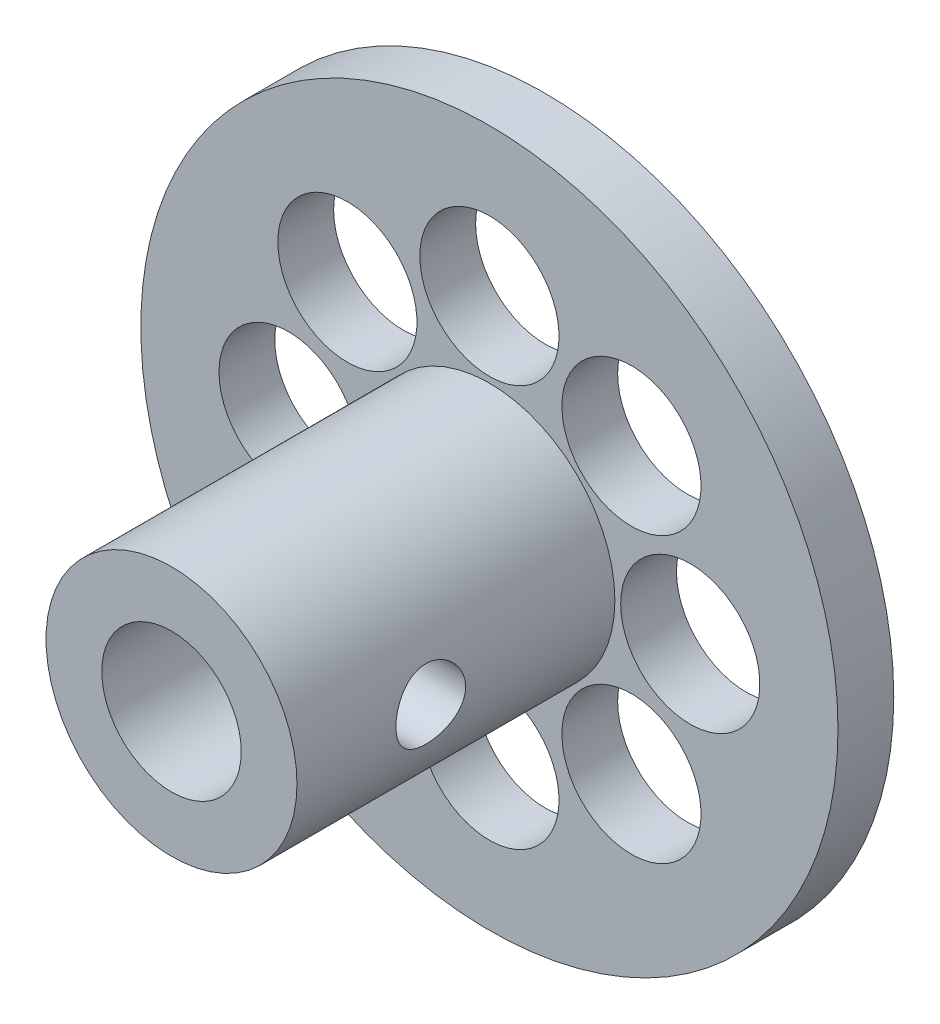
ISO-10303-21;
HEADER;
FILE_DESCRIPTION(('STEP AP214'),'2;1');
FILE_NAME('part.step','',(''),(''),'','','');
FILE_SCHEMA(('AUTOMOTIVE_DESIGN { 1 0 10303 214 1 1 1 1 }'));
ENDSEC;
DATA;
#1=APPLICATION_CONTEXT('core data for automotive mechanical design processes');
#2=APPLICATION_PROTOCOL_DEFINITION('international standard','automotive_design',2000,#1);
#3=PRODUCT_CONTEXT('',#1,'mechanical');
#4=PRODUCT('Part','Part','',(#3));
#5=PRODUCT_RELATED_PRODUCT_CATEGORY('part','',(#4));
#6=PRODUCT_DEFINITION_FORMATION('','',#4);
#7=PRODUCT_DEFINITION_CONTEXT('part definition',#1,'design');
#8=PRODUCT_DEFINITION('design','',#6,#7);
#9=PRODUCT_DEFINITION_SHAPE('','',#8);
#10=(LENGTH_UNIT() NAMED_UNIT(*) SI_UNIT(.MILLI.,.METRE.));
#11=(NAMED_UNIT(*) PLANE_ANGLE_UNIT() SI_UNIT($,.RADIAN.));
#12=(NAMED_UNIT(*) SI_UNIT($,.STERADIAN.) SOLID_ANGLE_UNIT());
#13=UNCERTAINTY_MEASURE_WITH_UNIT(LENGTH_MEASURE(1.E-05),#10,'distance_accuracy_value','');
#14=(GEOMETRIC_REPRESENTATION_CONTEXT(3) GLOBAL_UNCERTAINTY_ASSIGNED_CONTEXT((#13)) GLOBAL_UNIT_ASSIGNED_CONTEXT((#10,
#11,#12)) REPRESENTATION_CONTEXT('',''));
#15=CARTESIAN_POINT('',(0.,0.,0.));
#16=DIRECTION('',(0.,0.,1.));
#17=DIRECTION('',(1.,0.,0.));
#18=AXIS2_PLACEMENT_3D('',#15,#16,#17);
#19=CARTESIAN_POINT('',(0.,0.,5.08));
#20=DIRECTION('',(0.,0.,-1.));
#21=DIRECTION('',(-1.,0.,0.));
#22=AXIS2_PLACEMENT_3D('',#19,#20,#21);
#23=CYLINDRICAL_SURFACE('',#22,6.35);
#24=CARTESIAN_POINT('',(0.,0.,34.036));
#25=DIRECTION('',(0.,0.,1.));
#26=DIRECTION('',(1.,0.,0.));
#27=AXIS2_PLACEMENT_3D('',#24,#25,#26);
#28=CIRCLE('',#27,6.35);
#29=CARTESIAN_POINT('',(6.35,0.,34.036));
#30=VERTEX_POINT('',#29);
#31=EDGE_CURVE('E171',#30,#30,#28,.T.);
#32=ORIENTED_EDGE('',*,*,#31,.T.);
#33=EDGE_LOOP('',(#32));
#34=FACE_BOUND('',#33,.T.);
#35=CARTESIAN_POINT('',(0.,0.,0.));
#36=DIRECTION('',(0.,0.,-1.));
#37=DIRECTION('',(-1.,0.,0.));
#38=AXIS2_PLACEMENT_3D('',#35,#36,#37);
#39=CIRCLE('',#38,6.35);
#40=CARTESIAN_POINT('',(-6.35,0.,0.));
#41=VERTEX_POINT('',#40);
#42=EDGE_CURVE('E48',#41,#41,#39,.T.);
#43=ORIENTED_EDGE('',*,*,#42,.T.);
#44=EDGE_LOOP('',(#43));
#45=FACE_BOUND('',#44,.T.);
#46=CARTESIAN_POINT('',(6.35,0.,25.0263136778995));
#47=CARTESIAN_POINT('',(6.34999931166444,0.0834969220594999,25.0263127901819));
#48=CARTESIAN_POINT('',(6.34834758911701,0.167002655580042,25.0230138034535));
#49=CARTESIAN_POINT('',(6.34179105821714,0.333378330258781,25.0098678033496));
#50=CARTESIAN_POINT('',(6.33688483467113,0.416247978955771,25.0000179413737));
#51=CARTESIAN_POINT('',(6.31742426748325,0.66318203064701,24.9607416128535));
#52=CARTESIAN_POINT('',(6.29812827299425,0.825450146761554,24.9215886004981));
#53=CARTESIAN_POINT('',(6.2489182313574,1.13965128900426,24.8193229666053));
#54=CARTESIAN_POINT('',(6.21904547786825,1.29162180811868,24.7563034586561));
#55=CARTESIAN_POINT('',(6.15142812041637,1.58264035037879,24.6085776042706));
#56=CARTESIAN_POINT('',(6.11368413715877,1.72168939123018,24.5238729677485));
#57=CARTESIAN_POINT('',(6.03111096182982,1.99234108848171,24.3293440481653));
#58=CARTESIAN_POINT('',(5.98599127270818,2.12298433900091,24.2183101001056));
#59=CARTESIAN_POINT('',(5.89470535591056,2.36467069069853,23.9769169943267));
#60=CARTESIAN_POINT('',(5.84853836069043,2.47569885601321,23.8465432481331));
#61=CARTESIAN_POINT('',(5.75623634934464,2.68368848497886,23.5578927301462));
#62=CARTESIAN_POINT('',(5.71038146176788,2.77889135161934,23.3982361465979));
#63=CARTESIAN_POINT('',(5.64919759286363,2.90019349951534,23.1467656907251));
#64=CARTESIAN_POINT('',(5.63006420805933,2.93705266116892,23.0609136160708));
#65=CARTESIAN_POINT('',(5.59504604853267,3.00322508739606,22.8857280641931));
#66=CARTESIAN_POINT('',(5.57915935583429,3.03254280972159,22.7963966797189));
#67=CARTESIAN_POINT('',(5.55212611635049,3.08174263292982,22.6203031259348));
#68=CARTESIAN_POINT('',(5.54075429137746,3.10208128111978,22.5337028838709));
#69=CARTESIAN_POINT('',(5.52193654886444,3.13545600360765,22.3587263989051));
#70=CARTESIAN_POINT('',(5.51448854851135,3.14849595237258,22.2703511241278));
#71=CARTESIAN_POINT('',(5.50383875782918,3.1670771305344,22.0926069390509));
#72=CARTESIAN_POINT('',(5.50063441026522,3.1726228759965,22.0032386599121));
#73=CARTESIAN_POINT('',(5.49859788398609,3.17614778806993,21.8243328937214));
#74=CARTESIAN_POINT('',(5.49976528812799,3.17412767659872,21.7347954236282));
#75=CARTESIAN_POINT('',(5.50899190362732,3.1581193033026,21.4885658021751));
#76=CARTESIAN_POINT('',(5.52160857357707,3.13621253452965,21.3324719480861));
#77=CARTESIAN_POINT('',(5.55866493052824,3.07003746372168,21.026667036593));
#78=CARTESIAN_POINT('',(5.58310838358077,3.02576203854505,20.8769580288767));
#79=CARTESIAN_POINT('',(5.64157885407236,2.91531509833647,20.5837693813354));
#80=CARTESIAN_POINT('',(5.67581583876129,2.84865758129418,20.4405160679629));
#81=CARTESIAN_POINT('',(5.75003268807633,2.69570761526054,20.1665475917255));
#82=CARTESIAN_POINT('',(5.79001512927804,2.60940634674629,20.035838098291));
#83=CARTESIAN_POINT('',(5.87734289018611,2.40685964249565,19.7732094036492));
#84=CARTESIAN_POINT('',(5.92497898403936,2.28820488335253,19.643238293043));
#85=CARTESIAN_POINT('',(6.01813700574905,2.03058898448427,19.4042285350357));
#86=CARTESIAN_POINT('',(6.06365791538158,1.89161819563546,19.2951998915408));
#87=CARTESIAN_POINT('',(6.1500381059768,1.58913989972483,19.0964117581798));
#88=CARTESIAN_POINT('',(6.19058274974572,1.42479265164789,19.0077821923196));
#89=CARTESIAN_POINT('',(6.25976272299952,1.08098023585583,18.8601555962641));
#90=CARTESIAN_POINT('',(6.28840750578946,0.901527205073898,18.8011350367678));
#91=CARTESIAN_POINT('',(6.32854759690358,0.548533610626836,18.7192542745004));
#92=CARTESIAN_POINT('',(6.34126679122995,0.375734359385247,18.6938040053122));
#93=CARTESIAN_POINT('',(6.35231817716325,0.0278752299448339,18.6716631556392));
#94=CARTESIAN_POINT('',(6.35065718436129,-0.147183538060017,18.6749589507602));
#95=CARTESIAN_POINT('',(6.33384535408399,-0.48016468608036,18.7087199138449));
#96=CARTESIAN_POINT('',(6.31975005060431,-0.638363620564188,18.7370594693743));
#97=CARTESIAN_POINT('',(6.28085393924121,-0.947441883052999,18.8167695561094));
#98=CARTESIAN_POINT('',(6.25605195113515,-1.09832040207141,18.8681426263768));
#99=CARTESIAN_POINT('',(6.19709998236334,-1.39347133182512,18.9938088088373));
#100=CARTESIAN_POINT('',(6.16270299610718,-1.53743151047822,19.0687152620107));
#101=CARTESIAN_POINT('',(6.08787118465664,-1.8112148234104,19.2386301035854));
#102=CARTESIAN_POINT('',(6.0474337895468,-1.94103189959927,19.3336470552849));
#103=CARTESIAN_POINT('',(5.95973602709938,-2.19636241342679,19.5518530282733));
#104=CARTESIAN_POINT('',(5.91219559251098,-2.3202013468198,19.6768922850111));
#105=CARTESIAN_POINT('',(5.81858093231368,-2.54589381918874,19.9460760330492));
#106=CARTESIAN_POINT('',(5.77250773963547,-2.6477321493525,20.0902336302804));
#107=CARTESIAN_POINT('',(5.68487535288742,-2.83117262876716,20.4023822798579));
#108=CARTESIAN_POINT('',(5.64364281441821,-2.91155594998014,20.5711894474099));
#109=CARTESIAN_POINT('',(5.5744767953732,-3.04191297152939,20.9226581427892));
#110=CARTESIAN_POINT('',(5.54652618900868,-3.0919258549222,21.1053014757469));
#111=CARTESIAN_POINT('',(5.51057765714603,-3.15551086037918,21.4605036343697));
#112=CARTESIAN_POINT('',(5.50092192343244,-3.17212027309711,21.6323474283067));
#113=CARTESIAN_POINT('',(5.49800001145358,-3.17718805563876,21.9765581203947));
#114=CARTESIAN_POINT('',(5.5047267290444,-3.16565862768386,22.1489247594421));
#115=CARTESIAN_POINT('',(5.53205211477784,-3.11761548073658,22.4719737809734));
#116=CARTESIAN_POINT('',(5.55126823076269,-3.08358651207687,22.6231576196306));
#117=CARTESIAN_POINT('',(5.59977978302582,-2.99458164828807,22.9175045080667));
#118=CARTESIAN_POINT('',(5.62907846127335,-2.93959901505999,23.0606649607498));
#119=CARTESIAN_POINT('',(5.69685576337174,-2.8061154442137,23.345547377328));
#120=CARTESIAN_POINT('',(5.73581889480532,-2.72628260503929,23.4865264872652));
#121=CARTESIAN_POINT('',(5.81772207082382,-2.54682759156583,23.7540111096226));
#122=CARTESIAN_POINT('',(5.8606641782013,-2.44719512169931,23.8805090378422));
#123=CARTESIAN_POINT('',(5.95192753761203,-2.21680287661219,24.1314112020766));
#124=CARTESIAN_POINT('',(6.00026839877346,-2.08373188558713,24.2536934343123));
#125=CARTESIAN_POINT('',(6.0921234557675,-1.79751265125244,24.4747115511326));
#126=CARTESIAN_POINT('',(6.13563504323043,-1.64435365457428,24.5734347438822));
#127=CARTESIAN_POINT('',(6.19391073190243,-1.40178715704487,24.7015939440966));
#128=CARTESIAN_POINT('',(6.21223173271383,-1.31842200030919,24.7411142615809));
#129=CARTESIAN_POINT('',(6.24595363475603,-1.14807701021671,24.8129131527232));
#130=CARTESIAN_POINT('',(6.26135597012704,-1.06109897786306,24.8451952844339));
#131=CARTESIAN_POINT('',(6.28875097111981,-0.88436132281311,24.9020730238145));
#132=CARTESIAN_POINT('',(6.30075106809478,-0.794608244970574,24.9266853960376));
#133=CARTESIAN_POINT('',(6.32100983571903,-0.612925661591584,24.9679810674294));
#134=CARTESIAN_POINT('',(6.3292707916836,-0.520997521680293,24.984669210093));
#135=CARTESIAN_POINT('',(6.34032503263334,-0.357531347524377,25.0069299627619));
#136=CARTESIAN_POINT('',(6.34394670812889,-0.286274046488598,25.0141924991491));
#137=CARTESIAN_POINT('',(6.34878452045567,-0.143346668941348,25.0238848044371));
#138=CARTESIAN_POINT('',(6.35000059089052,-0.0716765810914262,25.0263144399463));
#139=CARTESIAN_POINT('',(6.35,0.,25.0263136778995));
#140=B_SPLINE_CURVE_WITH_KNOTS('',3,(#46,#47,#48,#49,#50,#51,#52,#53,#54,#55,#56,#57,#58,#59,
#60,#61,#62,#63,#64,#65,#66,#67,#68,#69,#70,#71,#72,#73,#74,#75,#76,#77,#78,#79,#80,#81,#82,#83,
#84,#85,#86,#87,#88,#89,#90,#91,#92,#93,#94,#95,#96,#97,#98,#99,#100,#101,#102,#103,#104,#105,
#106,#107,#108,#109,#110,#111,#112,#113,#114,#115,#116,#117,#118,#119,#120,#121,#122,#123,#124,
#125,#126,#127,#128,#129,#130,#131,#132,#133,#134,#135,#136,#137,#138,#139),.UNSPECIFIED.,.T.,
.F.,(4,2,2,2,2,2,2,2,2,2,2,2,2,2,2,2,2,2,2,2,2,2,2,2,2,2,2,2,2,2,2,2,2,2,2,2,2,2,2,2,2,2,2,2,2,
2,4),(0.,0.25041561210268,0.500940186864013,1.00234854488129,1.50182051324263,2.00125310940106,
2.53090025348451,3.06094897410615,3.63210298373098,3.91787290005988,4.20347350732849,
4.47213270490103,4.74064915090148,5.00900371453887,5.27733267302577,5.74927594687739,
6.22136960256846,6.70445970327764,7.18776712794021,7.73235646527881,8.27720530143646,
8.84735553323666,9.41705196489304,9.93956405039339,10.4618285011675,10.9436138594975,
11.4254523397102,11.921067756814,12.4168946391879,12.9614122158798,13.5063050164601,
14.077585736555,14.6481278321882,15.1639000911419,15.6794487286237,16.1458838633213,
16.6124691169503,17.1104020806943,17.6085946442304,18.1673210354482,18.7263477502426,
19.0082017078365,19.2899168101042,19.5710117490933,19.8519346536844,20.0668939492148,
20.2818591776892),.UNSPECIFIED.);
#141=CARTESIAN_POINT('',(6.35,0.,25.0263136778995));
#142=VERTEX_POINT('',#141);
#143=EDGE_CURVE('E73',#142,#142,#140,.T.);
#144=ORIENTED_EDGE('',*,*,#143,.F.);
#145=EDGE_LOOP('',(#144));
#146=FACE_BOUND('',#145,.T.);
#147=CARTESIAN_POINT('',(-6.35,0.,25.0263136778995));
#148=CARTESIAN_POINT('',(-6.34999931166444,-0.0834969220594999,25.0263127901819));
#149=CARTESIAN_POINT('',(-6.34834758911701,-0.167002655580042,25.0230138034535));
#150=CARTESIAN_POINT('',(-6.34179105821714,-0.333378330258781,25.0098678033496));
#151=CARTESIAN_POINT('',(-6.33688483467113,-0.416247978955771,25.0000179413737));
#152=CARTESIAN_POINT('',(-6.31742426748325,-0.66318203064701,24.9607416128535));
#153=CARTESIAN_POINT('',(-6.29812827299425,-0.825450146761554,24.9215886004981));
#154=CARTESIAN_POINT('',(-6.2489182313574,-1.13965128900426,24.8193229666053));
#155=CARTESIAN_POINT('',(-6.21904547786825,-1.29162180811868,24.7563034586561));
#156=CARTESIAN_POINT('',(-6.15142812041637,-1.58264035037879,24.6085776042706));
#157=CARTESIAN_POINT('',(-6.11368413715877,-1.72168939123018,24.5238729677485));
#158=CARTESIAN_POINT('',(-6.03111096182982,-1.99234108848171,24.3293440481653));
#159=CARTESIAN_POINT('',(-5.98599127270818,-2.12298433900091,24.2183101001056));
#160=CARTESIAN_POINT('',(-5.89470535591056,-2.36467069069853,23.9769169943267));
#161=CARTESIAN_POINT('',(-5.84853836069043,-2.47569885601321,23.8465432481331));
#162=CARTESIAN_POINT('',(-5.75623634934464,-2.68368848497886,23.5578927301462));
#163=CARTESIAN_POINT('',(-5.71038146176788,-2.77889135161934,23.3982361465979));
#164=CARTESIAN_POINT('',(-5.64919759286363,-2.90019349951534,23.1467656907251));
#165=CARTESIAN_POINT('',(-5.63006420805933,-2.93705266116892,23.0609136160708));
#166=CARTESIAN_POINT('',(-5.59504604853267,-3.00322508739606,22.8857280641931));
#167=CARTESIAN_POINT('',(-5.57915935583429,-3.03254280972159,22.7963966797189));
#168=CARTESIAN_POINT('',(-5.55212611635049,-3.08174263292982,22.6203031259348));
#169=CARTESIAN_POINT('',(-5.54075429137746,-3.10208128111978,22.5337028838709));
#170=CARTESIAN_POINT('',(-5.52193654886444,-3.13545600360765,22.3587263989051));
#171=CARTESIAN_POINT('',(-5.51448854851135,-3.14849595237258,22.2703511241278));
#172=CARTESIAN_POINT('',(-5.50383875782918,-3.1670771305344,22.0926069390509));
#173=CARTESIAN_POINT('',(-5.50063441026522,-3.1726228759965,22.0032386599121));
#174=CARTESIAN_POINT('',(-5.49859788398609,-3.17614778806993,21.8243328937214));
#175=CARTESIAN_POINT('',(-5.49976528812799,-3.17412767659872,21.7347954236282));
#176=CARTESIAN_POINT('',(-5.50899190362732,-3.1581193033026,21.4885658021751));
#177=CARTESIAN_POINT('',(-5.52160857357707,-3.13621253452965,21.3324719480861));
#178=CARTESIAN_POINT('',(-5.55866493052824,-3.07003746372168,21.026667036593));
#179=CARTESIAN_POINT('',(-5.58310838358077,-3.02576203854505,20.8769580288767));
#180=CARTESIAN_POINT('',(-5.64157885407236,-2.91531509833647,20.5837693813354));
#181=CARTESIAN_POINT('',(-5.67581583876129,-2.84865758129418,20.4405160679629));
#182=CARTESIAN_POINT('',(-5.75003268807633,-2.69570761526054,20.1665475917255));
#183=CARTESIAN_POINT('',(-5.79001512927804,-2.60940634674629,20.035838098291));
#184=CARTESIAN_POINT('',(-5.87734289018611,-2.40685964249565,19.7732094036492));
#185=CARTESIAN_POINT('',(-5.92497898403936,-2.28820488335253,19.643238293043));
#186=CARTESIAN_POINT('',(-6.01813700574905,-2.03058898448427,19.4042285350357));
#187=CARTESIAN_POINT('',(-6.06365791538158,-1.89161819563546,19.2951998915408));
#188=CARTESIAN_POINT('',(-6.1500381059768,-1.58913989972483,19.0964117581798));
#189=CARTESIAN_POINT('',(-6.19058274974572,-1.42479265164789,19.0077821923196));
#190=CARTESIAN_POINT('',(-6.25976272299952,-1.08098023585583,18.8601555962641));
#191=CARTESIAN_POINT('',(-6.28840750578946,-0.901527205073898,18.8011350367678));
#192=CARTESIAN_POINT('',(-6.32854759690358,-0.548533610626836,18.7192542745004));
#193=CARTESIAN_POINT('',(-6.34126679122995,-0.375734359385247,18.6938040053122));
#194=CARTESIAN_POINT('',(-6.35231817716325,-0.0278752299448339,18.6716631556392));
#195=CARTESIAN_POINT('',(-6.35065718436129,0.147183538060017,18.6749589507602));
#196=CARTESIAN_POINT('',(-6.33384535408399,0.48016468608036,18.7087199138449));
#197=CARTESIAN_POINT('',(-6.31975005060431,0.638363620564188,18.7370594693743));
#198=CARTESIAN_POINT('',(-6.28085393924121,0.947441883052999,18.8167695561094));
#199=CARTESIAN_POINT('',(-6.25605195113515,1.09832040207141,18.8681426263768));
#200=CARTESIAN_POINT('',(-6.19709998236334,1.39347133182512,18.9938088088373));
#201=CARTESIAN_POINT('',(-6.16270299610718,1.53743151047822,19.0687152620107));
#202=CARTESIAN_POINT('',(-6.08787118465664,1.8112148234104,19.2386301035854));
#203=CARTESIAN_POINT('',(-6.0474337895468,1.94103189959927,19.3336470552849));
#204=CARTESIAN_POINT('',(-5.95973602709938,2.19636241342679,19.5518530282733));
#205=CARTESIAN_POINT('',(-5.91219559251098,2.3202013468198,19.6768922850111));
#206=CARTESIAN_POINT('',(-5.81858093231368,2.54589381918874,19.9460760330492));
#207=CARTESIAN_POINT('',(-5.77250773963547,2.6477321493525,20.0902336302804));
#208=CARTESIAN_POINT('',(-5.68487535288742,2.83117262876716,20.4023822798579));
#209=CARTESIAN_POINT('',(-5.64364281441821,2.91155594998014,20.5711894474099));
#210=CARTESIAN_POINT('',(-5.5744767953732,3.04191297152939,20.9226581427892));
#211=CARTESIAN_POINT('',(-5.54652618900868,3.0919258549222,21.1053014757469));
#212=CARTESIAN_POINT('',(-5.51057765714603,3.15551086037918,21.4605036343697));
#213=CARTESIAN_POINT('',(-5.50092192343244,3.17212027309711,21.6323474283067));
#214=CARTESIAN_POINT('',(-5.49800001145358,3.17718805563876,21.9765581203947));
#215=CARTESIAN_POINT('',(-5.5047267290444,3.16565862768386,22.1489247594421));
#216=CARTESIAN_POINT('',(-5.53205211477784,3.11761548073658,22.4719737809734));
#217=CARTESIAN_POINT('',(-5.55126823076269,3.08358651207687,22.6231576196306));
#218=CARTESIAN_POINT('',(-5.59977978302582,2.99458164828807,22.9175045080667));
#219=CARTESIAN_POINT('',(-5.62907846127335,2.93959901505999,23.0606649607498));
#220=CARTESIAN_POINT('',(-5.69685576337174,2.8061154442137,23.345547377328));
#221=CARTESIAN_POINT('',(-5.73581889480532,2.72628260503929,23.4865264872652));
#222=CARTESIAN_POINT('',(-5.81772207082382,2.54682759156583,23.7540111096226));
#223=CARTESIAN_POINT('',(-5.8606641782013,2.44719512169931,23.8805090378422));
#224=CARTESIAN_POINT('',(-5.95192753761203,2.21680287661219,24.1314112020766));
#225=CARTESIAN_POINT('',(-6.00026839877346,2.08373188558713,24.2536934343123));
#226=CARTESIAN_POINT('',(-6.0921234557675,1.79751265125244,24.4747115511326));
#227=CARTESIAN_POINT('',(-6.13563504323043,1.64435365457428,24.5734347438822));
#228=CARTESIAN_POINT('',(-6.19391073190243,1.40178715704487,24.7015939440966));
#229=CARTESIAN_POINT('',(-6.21223173271383,1.31842200030919,24.7411142615809));
#230=CARTESIAN_POINT('',(-6.24595363475603,1.14807701021671,24.8129131527232));
#231=CARTESIAN_POINT('',(-6.26135597012704,1.06109897786306,24.8451952844339));
#232=CARTESIAN_POINT('',(-6.28875097111981,0.88436132281311,24.9020730238145));
#233=CARTESIAN_POINT('',(-6.30075106809478,0.794608244970574,24.9266853960376));
#234=CARTESIAN_POINT('',(-6.32100983571903,0.612925661591584,24.9679810674294));
#235=CARTESIAN_POINT('',(-6.3292707916836,0.520997521680293,24.984669210093));
#236=CARTESIAN_POINT('',(-6.34032503263334,0.357531347524377,25.0069299627619));
#237=CARTESIAN_POINT('',(-6.34394670812889,0.286274046488598,25.0141924991491));
#238=CARTESIAN_POINT('',(-6.34878452045567,0.143346668941348,25.0238848044371));
#239=CARTESIAN_POINT('',(-6.35000059089052,0.0716765810914262,25.0263144399463));
#240=CARTESIAN_POINT('',(-6.35,0.,25.0263136778995));
#241=B_SPLINE_CURVE_WITH_KNOTS('',3,(#147,#148,#149,#150,#151,#152,#153,#154,#155,#156,#157,
#158,#159,#160,#161,#162,#163,#164,#165,#166,#167,#168,#169,#170,#171,#172,#173,#174,#175,#176,
#177,#178,#179,#180,#181,#182,#183,#184,#185,#186,#187,#188,#189,#190,#191,#192,#193,#194,#195,
#196,#197,#198,#199,#200,#201,#202,#203,#204,#205,#206,#207,#208,#209,#210,#211,#212,#213,#214,
#215,#216,#217,#218,#219,#220,#221,#222,#223,#224,#225,#226,#227,#228,#229,#230,#231,#232,#233,
#234,#235,#236,#237,#238,#239,#240),.UNSPECIFIED.,.T.,.F.,(4,2,2,2,2,2,2,2,2,2,2,2,2,2,2,2,2,2,
2,2,2,2,2,2,2,2,2,2,2,2,2,2,2,2,2,2,2,2,2,2,2,2,2,2,2,2,4),(0.,0.25041561210268,
0.500940186864013,1.00234854488129,1.50182051324263,2.00125310940106,2.53090025348451,
3.06094897410615,3.63210298373098,3.91787290005988,4.20347350732849,4.47213270490103,
4.74064915090148,5.00900371453887,5.27733267302577,5.74927594687739,6.22136960256846,
6.70445970327764,7.18776712794021,7.73235646527881,8.27720530143646,8.84735553323666,
9.41705196489304,9.93956405039339,10.4618285011675,10.9436138594975,11.4254523397102,
11.921067756814,12.4168946391879,12.9614122158798,13.5063050164601,14.077585736555,
14.6481278321882,15.1639000911419,15.6794487286237,16.1458838633213,16.6124691169503,
17.1104020806943,17.6085946442304,18.1673210354482,18.7263477502426,19.0082017078365,
19.2899168101042,19.5710117490933,19.8519346536844,20.0668939492148,20.2818591776892),.UNSPECIFIED.);
#242=CARTESIAN_POINT('',(-6.35,0.,25.0263136778995));
#243=VERTEX_POINT('',#242);
#244=EDGE_CURVE('E77',#243,#243,#241,.T.);
#245=ORIENTED_EDGE('',*,*,#244,.F.);
#246=EDGE_LOOP('',(#245));
#247=FACE_BOUND('',#246,.T.);
#248=ADVANCED_FACE('F31',(#34,#45,#146,#247),#23,.F.);
#249=CARTESIAN_POINT('',(0.,0.,34.036));
#250=DIRECTION('',(0.,0.,-1.));
#251=DIRECTION('',(-1.,0.,0.));
#252=AXIS2_PLACEMENT_3D('',#249,#250,#251);
#253=CYLINDRICAL_SURFACE('',#252,11.43);
#254=CARTESIAN_POINT('',(0.,0.,34.036));
#255=DIRECTION('',(0.,0.,1.));
#256=DIRECTION('',(1.,0.,0.));
#257=AXIS2_PLACEMENT_3D('',#254,#255,#256);
#258=CIRCLE('',#257,11.43);
#259=CARTESIAN_POINT('',(11.43,0.,34.036));
#260=VERTEX_POINT('',#259);
#261=EDGE_CURVE('E148',#260,#260,#258,.T.);
#262=ORIENTED_EDGE('',*,*,#261,.F.);
#263=EDGE_LOOP('',(#262));
#264=FACE_BOUND('',#263,.T.);
#265=CARTESIAN_POINT('',(0.,0.,5.08));
#266=DIRECTION('',(0.,0.,1.));
#267=DIRECTION('',(1.,0.,0.));
#268=AXIS2_PLACEMENT_3D('',#265,#266,#267);
#269=CIRCLE('',#268,11.43);
#270=CARTESIAN_POINT('',(11.43,0.,5.08));
#271=VERTEX_POINT('',#270);
#272=EDGE_CURVE('E152',#271,#271,#269,.T.);
#273=ORIENTED_EDGE('',*,*,#272,.T.);
#274=EDGE_LOOP('',(#273));
#275=FACE_BOUND('',#274,.T.);
#276=CARTESIAN_POINT('',(11.43,0.,25.0263136778995));
#277=CARTESIAN_POINT('',(11.42999766363,-0.174755177243275,25.026310122953));
#278=CARTESIAN_POINT('',(11.4259531218055,-0.349547494331775,25.0118374055941));
#279=CARTESIAN_POINT('',(11.4102121350353,-0.694079069025366,24.9544425281056));
#280=CARTESIAN_POINT('',(11.3985124619913,-0.863816163305136,24.9115083659466));
#281=CARTESIAN_POINT('',(11.3687495610225,-1.19321567218797,24.7987075305881));
#282=CARTESIAN_POINT('',(11.3506949269856,-1.352891350843,24.7288772174056));
#283=CARTESIAN_POINT('',(11.3101199395835,-1.6582661659141,24.5644057718292));
#284=CARTESIAN_POINT('',(11.2875991897758,-1.80396405986325,24.4697624366245));
#285=CARTESIAN_POINT('',(11.239885008561,-2.08088683317843,24.2558569159387));
#286=CARTESIAN_POINT('',(11.2146428900297,-2.21171290653347,24.1360892970935));
#287=CARTESIAN_POINT('',(11.1646362207905,-2.45170499166875,23.8764143340102));
#288=CARTESIAN_POINT('',(11.1398717377078,-2.56086795634788,23.7365041613189));
#289=CARTESIAN_POINT('',(11.093120925035,-2.75642853794001,23.4372712371726));
#290=CARTESIAN_POINT('',(11.0711957376531,-2.84235842367428,23.2776323684583));
#291=CARTESIAN_POINT('',(11.0333256807057,-2.98599751113174,22.9454646070878));
#292=CARTESIAN_POINT('',(11.0173796034987,-3.04371241234347,22.7729383258411));
#293=CARTESIAN_POINT('',(10.9937774311909,-3.12788107894752,22.4243305942134));
#294=CARTESIAN_POINT('',(10.9859289021294,-3.15506193736422,22.2484380509759));
#295=CARTESIAN_POINT('',(10.978836292032,-3.17965904777505,21.8944279286211));
#296=CARTESIAN_POINT('',(10.9795904537965,-3.17708137829375,21.7163108113235));
#297=CARTESIAN_POINT('',(10.9894463173566,-3.14280985197708,21.3686570899404));
#298=CARTESIAN_POINT('',(10.9982929811428,-3.11200551767545,21.1990244020982));
#299=CARTESIAN_POINT('',(11.0229273329975,-3.02358377252798,20.8674354612778));
#300=CARTESIAN_POINT('',(11.0387156177147,-2.96596405681169,20.70547986949));
#301=CARTESIAN_POINT('',(11.0756717723479,-2.82484507761553,20.3915700100028));
#302=CARTESIAN_POINT('',(11.0969023324568,-2.7410415546596,20.2397602162019));
#303=CARTESIAN_POINT('',(11.1423183473694,-2.55014579326271,19.9520500758978));
#304=CARTESIAN_POINT('',(11.1665044275304,-2.44304862237812,19.8161531083351));
#305=CARTESIAN_POINT('',(11.2161592320247,-2.20409925012249,19.559055421591));
#306=CARTESIAN_POINT('',(11.2416429989608,-2.07150279044399,19.4385482853047));
#307=CARTESIAN_POINT('',(11.2902542751942,-1.78766878229063,19.2213323217239));
#308=CARTESIAN_POINT('',(11.3133816752857,-1.63643037057179,19.1246245971192));
#309=CARTESIAN_POINT('',(11.3548373287042,-1.31847191051881,18.9574108661991));
#310=CARTESIAN_POINT('',(11.3731407955966,-1.15167764519928,18.8870394338947));
#311=CARTESIAN_POINT('',(11.4027075095367,-0.807999371475077,18.7755410678584));
#312=CARTESIAN_POINT('',(11.413972430422,-0.631117772867672,18.7344071808218));
#313=CARTESIAN_POINT('',(11.4279359066786,-0.278197583591382,18.6836615504809));
#314=CARTESIAN_POINT('',(11.4308903671303,-0.102304356881052,18.6731078298353));
#315=CARTESIAN_POINT('',(11.4286405994463,0.248742023816882,18.6812082535623));
#316=CARTESIAN_POINT('',(11.4234372922256,0.423895259102682,18.6998591010856));
#317=CARTESIAN_POINT('',(11.4056227324991,0.765065560215982,18.7650697465634));
#318=CARTESIAN_POINT('',(11.3931531640559,0.931192671936208,18.8110960983456));
#319=CARTESIAN_POINT('',(11.3622284609023,1.25334552002157,18.9291246217003));
#320=CARTESIAN_POINT('',(11.3437726512095,1.40937011488991,19.0011297226262));
#321=CARTESIAN_POINT('',(11.3023330032154,1.7104871566297,19.1707650081374));
#322=CARTESIAN_POINT('',(11.2792629720405,1.85528473736176,19.2688970096784));
#323=CARTESIAN_POINT('',(11.2312571190665,2.12668528329121,19.4873766628511));
#324=CARTESIAN_POINT('',(11.2063208971088,2.25328432916455,19.6077290872689));
#325=CARTESIAN_POINT('',(11.1564380041451,2.48872254843929,19.8716413453481));
#326=CARTESIAN_POINT('',(11.1315146483379,2.59689493028537,20.0158016048465));
#327=CARTESIAN_POINT('',(11.0853142100727,2.78753776830016,20.3207620981232));
#328=CARTESIAN_POINT('',(11.0640369881729,2.8700092074671,20.4815616951741));
#329=CARTESIAN_POINT('',(11.0277858929496,3.00629588817982,20.8145038893802));
#330=CARTESIAN_POINT('',(11.0127771366422,3.06027016807469,20.9865773776932));
#331=CARTESIAN_POINT('',(10.9907800713136,3.13836437334344,21.3378519397042));
#332=CARTESIAN_POINT('',(10.9837894964902,3.1624927328194,21.5170509850235));
#333=CARTESIAN_POINT('',(10.9788207736463,3.17969544335496,21.8706323578467));
#334=CARTESIAN_POINT('',(10.9805302463391,3.17384610376321,22.0449586805872));
#335=CARTESIAN_POINT('',(10.9920312794984,3.13377943948497,22.390034708178));
#336=CARTESIAN_POINT('',(11.0018225973266,3.09956296645387,22.5607845202467));
#337=CARTESIAN_POINT('',(11.0281902581527,3.00438119591898,22.8923764520351));
#338=CARTESIAN_POINT('',(11.0447040197124,2.9436622518855,23.0532946182204));
#339=CARTESIAN_POINT('',(11.0826528676069,2.79738967243553,23.3627849310725));
#340=CARTESIAN_POINT('',(11.1040887840607,2.71183184731037,23.5113549894743));
#341=CARTESIAN_POINT('',(11.150315793981,2.51512568353358,23.7970239160742));
#342=CARTESIAN_POINT('',(11.1751917461581,2.4032516942396,23.9336094286733));
#343=CARTESIAN_POINT('',(11.2250431304891,2.1584450797246,24.1864179029156));
#344=CARTESIAN_POINT('',(11.2500185857755,2.02550724089558,24.3026358082427));
#345=CARTESIAN_POINT('',(11.2979667253737,1.73852899006204,24.5141433448077));
#346=CARTESIAN_POINT('',(11.3208775662975,1.58406149768773,24.6088688011086));
#347=CARTESIAN_POINT('',(11.3614193624747,1.26075943603981,24.7708611516948));
#348=CARTESIAN_POINT('',(11.3790534174974,1.09193337664888,24.8381441750953));
#349=CARTESIAN_POINT('',(11.4050083007317,0.769989528767419,24.9354326829656));
#350=CARTESIAN_POINT('',(11.4143090398112,0.618145581508602,24.9694298383854));
#351=CARTESIAN_POINT('',(11.4268055683976,0.310877269261258,25.0148705862888));
#352=CARTESIAN_POINT('',(11.4300020783161,0.155453328969314,25.0263168401993));
#353=CARTESIAN_POINT('',(11.43,0.,25.0263136778995));
#354=B_SPLINE_CURVE_WITH_KNOTS('',3,(#276,#277,#278,#279,#280,#281,#282,#283,#284,#285,#286,
#287,#288,#289,#290,#291,#292,#293,#294,#295,#296,#297,#298,#299,#300,#301,#302,#303,#304,#305,
#306,#307,#308,#309,#310,#311,#312,#313,#314,#315,#316,#317,#318,#319,#320,#321,#322,#323,#324,
#325,#326,#327,#328,#329,#330,#331,#332,#333,#334,#335,#336,#337,#338,#339,#340,#341,#342,#343,
#344,#345,#346,#347,#348,#349,#350,#351,#352,#353),.UNSPECIFIED.,.T.,.F.,(4,2,2,2,2,2,2,2,2,2,2,
2,2,2,2,2,2,2,2,2,2,2,2,2,2,2,2,2,2,2,2,2,2,2,2,2,2,2,4),(0.,0.523695150472706,1.04761128081404,
1.57082161817485,2.09407842000835,2.62909365786171,3.16418409691748,3.70935733422126,
4.25442039978796,4.78620917131027,5.31788932072848,5.83336991806793,6.3488948308497,
6.87064818514386,7.39251212876515,7.93291514360052,8.47334319202812,9.01649620726433,
9.55952000600138,10.0856290690572,10.6116787449225,11.1277988640394,11.6439771988524,
12.1708913017706,12.6979187139757,13.2411721893636,13.7844048840835,14.3245729474402,
14.8645883308297,15.3853540210313,15.9061040770538,16.4221132965821,16.9382096048015,
17.4706765974128,18.0032755897908,18.5485555011113,19.0935144642007,19.5594220579948,
20.025274662709),.UNSPECIFIED.);
#355=CARTESIAN_POINT('',(11.43,0.,25.0263136778995));
#356=VERTEX_POINT('',#355);
#357=EDGE_CURVE('E52',#356,#356,#354,.T.);
#358=ORIENTED_EDGE('',*,*,#357,.F.);
#359=EDGE_LOOP('',(#358));
#360=FACE_BOUND('',#359,.T.);
#361=CARTESIAN_POINT('',(-11.43,0.,25.0263136778995));
#362=CARTESIAN_POINT('',(-11.42999766363,0.174755177243275,25.026310122953));
#363=CARTESIAN_POINT('',(-11.4259531218055,0.349547494331775,25.0118374055941));
#364=CARTESIAN_POINT('',(-11.4102121350353,0.694079069025366,24.9544425281056));
#365=CARTESIAN_POINT('',(-11.3985124619913,0.863816163305136,24.9115083659466));
#366=CARTESIAN_POINT('',(-11.3687495610225,1.19321567218797,24.7987075305881));
#367=CARTESIAN_POINT('',(-11.3506949269856,1.352891350843,24.7288772174056));
#368=CARTESIAN_POINT('',(-11.3101199395835,1.6582661659141,24.5644057718292));
#369=CARTESIAN_POINT('',(-11.2875991897758,1.80396405986325,24.4697624366245));
#370=CARTESIAN_POINT('',(-11.239885008561,2.08088683317843,24.2558569159387));
#371=CARTESIAN_POINT('',(-11.2146428900297,2.21171290653347,24.1360892970935));
#372=CARTESIAN_POINT('',(-11.1646362207905,2.45170499166875,23.8764143340102));
#373=CARTESIAN_POINT('',(-11.1398717377078,2.56086795634788,23.7365041613189));
#374=CARTESIAN_POINT('',(-11.093120925035,2.75642853794001,23.4372712371726));
#375=CARTESIAN_POINT('',(-11.0711957376531,2.84235842367428,23.2776323684583));
#376=CARTESIAN_POINT('',(-11.0333256807057,2.98599751113174,22.9454646070878));
#377=CARTESIAN_POINT('',(-11.0173796034987,3.04371241234347,22.7729383258411));
#378=CARTESIAN_POINT('',(-10.9937774311909,3.12788107894752,22.4243305942134));
#379=CARTESIAN_POINT('',(-10.9859289021294,3.15506193736422,22.2484380509759));
#380=CARTESIAN_POINT('',(-10.978836292032,3.17965904777505,21.8944279286211));
#381=CARTESIAN_POINT('',(-10.9795904537965,3.17708137829375,21.7163108113235));
#382=CARTESIAN_POINT('',(-10.9894463173566,3.14280985197708,21.3686570899404));
#383=CARTESIAN_POINT('',(-10.9982929811428,3.11200551767545,21.1990244020982));
#384=CARTESIAN_POINT('',(-11.0229273329975,3.02358377252798,20.8674354612778));
#385=CARTESIAN_POINT('',(-11.0387156177147,2.96596405681169,20.70547986949));
#386=CARTESIAN_POINT('',(-11.0756717723479,2.82484507761553,20.3915700100028));
#387=CARTESIAN_POINT('',(-11.0969023324568,2.7410415546596,20.2397602162019));
#388=CARTESIAN_POINT('',(-11.1423183473694,2.55014579326271,19.9520500758978));
#389=CARTESIAN_POINT('',(-11.1665044275304,2.44304862237812,19.8161531083351));
#390=CARTESIAN_POINT('',(-11.2161592320247,2.20409925012249,19.559055421591));
#391=CARTESIAN_POINT('',(-11.2416429989608,2.07150279044399,19.4385482853047));
#392=CARTESIAN_POINT('',(-11.2902542751942,1.78766878229063,19.2213323217239));
#393=CARTESIAN_POINT('',(-11.3133816752857,1.63643037057179,19.1246245971192));
#394=CARTESIAN_POINT('',(-11.3548373287042,1.31847191051881,18.9574108661991));
#395=CARTESIAN_POINT('',(-11.3731407955966,1.15167764519928,18.8870394338947));
#396=CARTESIAN_POINT('',(-11.4027075095367,0.807999371475077,18.7755410678584));
#397=CARTESIAN_POINT('',(-11.413972430422,0.631117772867672,18.7344071808218));
#398=CARTESIAN_POINT('',(-11.4279359066786,0.278197583591382,18.6836615504809));
#399=CARTESIAN_POINT('',(-11.4308903671303,0.102304356881052,18.6731078298353));
#400=CARTESIAN_POINT('',(-11.4286405994463,-0.248742023816882,18.6812082535623));
#401=CARTESIAN_POINT('',(-11.4234372922256,-0.423895259102682,18.6998591010856));
#402=CARTESIAN_POINT('',(-11.4056227324991,-0.765065560215982,18.7650697465634));
#403=CARTESIAN_POINT('',(-11.3931531640559,-0.931192671936208,18.8110960983456));
#404=CARTESIAN_POINT('',(-11.3622284609023,-1.25334552002157,18.9291246217003));
#405=CARTESIAN_POINT('',(-11.3437726512095,-1.40937011488991,19.0011297226262));
#406=CARTESIAN_POINT('',(-11.3023330032154,-1.7104871566297,19.1707650081374));
#407=CARTESIAN_POINT('',(-11.2792629720405,-1.85528473736176,19.2688970096784));
#408=CARTESIAN_POINT('',(-11.2312571190665,-2.12668528329121,19.4873766628511));
#409=CARTESIAN_POINT('',(-11.2063208971088,-2.25328432916455,19.6077290872689));
#410=CARTESIAN_POINT('',(-11.1564380041451,-2.48872254843929,19.8716413453481));
#411=CARTESIAN_POINT('',(-11.1315146483379,-2.59689493028537,20.0158016048465));
#412=CARTESIAN_POINT('',(-11.0853142100727,-2.78753776830016,20.3207620981232));
#413=CARTESIAN_POINT('',(-11.0640369881729,-2.8700092074671,20.4815616951741));
#414=CARTESIAN_POINT('',(-11.0277858929496,-3.00629588817982,20.8145038893802));
#415=CARTESIAN_POINT('',(-11.0127771366422,-3.06027016807469,20.9865773776932));
#416=CARTESIAN_POINT('',(-10.9907800713136,-3.13836437334344,21.3378519397042));
#417=CARTESIAN_POINT('',(-10.9837894964902,-3.1624927328194,21.5170509850235));
#418=CARTESIAN_POINT('',(-10.9788207736463,-3.17969544335496,21.8706323578467));
#419=CARTESIAN_POINT('',(-10.9805302463391,-3.17384610376321,22.0449586805872));
#420=CARTESIAN_POINT('',(-10.9920312794984,-3.13377943948497,22.390034708178));
#421=CARTESIAN_POINT('',(-11.0018225973266,-3.09956296645387,22.5607845202467));
#422=CARTESIAN_POINT('',(-11.0281902581527,-3.00438119591898,22.8923764520351));
#423=CARTESIAN_POINT('',(-11.0447040197124,-2.9436622518855,23.0532946182204));
#424=CARTESIAN_POINT('',(-11.0826528676069,-2.79738967243553,23.3627849310725));
#425=CARTESIAN_POINT('',(-11.1040887840607,-2.71183184731037,23.5113549894743));
#426=CARTESIAN_POINT('',(-11.150315793981,-2.51512568353358,23.7970239160742));
#427=CARTESIAN_POINT('',(-11.1751917461581,-2.4032516942396,23.9336094286733));
#428=CARTESIAN_POINT('',(-11.2250431304891,-2.1584450797246,24.1864179029156));
#429=CARTESIAN_POINT('',(-11.2500185857755,-2.02550724089558,24.3026358082427));
#430=CARTESIAN_POINT('',(-11.2979667253737,-1.73852899006204,24.5141433448077));
#431=CARTESIAN_POINT('',(-11.3208775662975,-1.58406149768773,24.6088688011086));
#432=CARTESIAN_POINT('',(-11.3614193624747,-1.26075943603981,24.7708611516948));
#433=CARTESIAN_POINT('',(-11.3790534174974,-1.09193337664888,24.8381441750953));
#434=CARTESIAN_POINT('',(-11.4050083007317,-0.769989528767419,24.9354326829656));
#435=CARTESIAN_POINT('',(-11.4143090398112,-0.618145581508602,24.9694298383854));
#436=CARTESIAN_POINT('',(-11.4268055683976,-0.310877269261258,25.0148705862888));
#437=CARTESIAN_POINT('',(-11.4300020783161,-0.155453328969315,25.0263168401993));
#438=CARTESIAN_POINT('',(-11.43,0.,25.0263136778995));
#439=B_SPLINE_CURVE_WITH_KNOTS('',3,(#361,#362,#363,#364,#365,#366,#367,#368,#369,#370,#371,
#372,#373,#374,#375,#376,#377,#378,#379,#380,#381,#382,#383,#384,#385,#386,#387,#388,#389,#390,
#391,#392,#393,#394,#395,#396,#397,#398,#399,#400,#401,#402,#403,#404,#405,#406,#407,#408,#409,
#410,#411,#412,#413,#414,#415,#416,#417,#418,#419,#420,#421,#422,#423,#424,#425,#426,#427,#428,
#429,#430,#431,#432,#433,#434,#435,#436,#437,#438),.UNSPECIFIED.,.T.,.F.,(4,2,2,2,2,2,2,2,2,2,2,
2,2,2,2,2,2,2,2,2,2,2,2,2,2,2,2,2,2,2,2,2,2,2,2,2,2,2,4),(0.,0.523695150472706,1.04761128081404,
1.57082161817485,2.09407842000835,2.62909365786171,3.16418409691748,3.70935733422126,
4.25442039978796,4.78620917131027,5.31788932072848,5.83336991806793,6.3488948308497,
6.87064818514386,7.39251212876515,7.93291514360052,8.47334319202812,9.01649620726433,
9.55952000600138,10.0856290690572,10.6116787449225,11.1277988640394,11.6439771988524,
12.1708913017706,12.6979187139757,13.2411721893636,13.7844048840835,14.3245729474402,
14.8645883308297,15.3853540210313,15.9061040770538,16.4221132965821,16.9382096048015,
17.4706765974128,18.0032755897908,18.5485555011113,19.0935144642007,19.5594220579948,
20.025274662709),.UNSPECIFIED.);
#440=CARTESIAN_POINT('',(-11.43,0.,25.0263136778995));
#441=VERTEX_POINT('',#440);
#442=EDGE_CURVE('E35',#441,#441,#439,.T.);
#443=ORIENTED_EDGE('',*,*,#442,.F.);
#444=EDGE_LOOP('',(#443));
#445=FACE_BOUND('',#444,.T.);
#446=ADVANCED_FACE('F56',(#264,#275,#360,#445),#253,.T.);
#447=CARTESIAN_POINT('',(0.,0.,5.08));
#448=DIRECTION('',(0.,0.,-1.));
#449=DIRECTION('',(-1.,0.,0.));
#450=AXIS2_PLACEMENT_3D('',#447,#448,#449);
#451=CYLINDRICAL_SURFACE('',#450,31.75);
#452=CARTESIAN_POINT('',(0.,0.,5.08));
#453=DIRECTION('',(0.,0.,1.));
#454=DIRECTION('',(1.,0.,0.));
#455=AXIS2_PLACEMENT_3D('',#452,#453,#454);
#456=CIRCLE('',#455,31.75);
#457=CARTESIAN_POINT('',(31.75,0.,5.08));
#458=VERTEX_POINT('',#457);
#459=EDGE_CURVE('E10',#458,#458,#456,.T.);
#460=ORIENTED_EDGE('',*,*,#459,.F.);
#461=EDGE_LOOP('',(#460));
#462=FACE_BOUND('',#461,.T.);
#463=CARTESIAN_POINT('',(0.,0.,0.));
#464=DIRECTION('',(0.,0.,1.));
#465=DIRECTION('',(1.,0.,0.));
#466=AXIS2_PLACEMENT_3D('',#463,#464,#465);
#467=CIRCLE('',#466,31.75);
#468=CARTESIAN_POINT('',(31.75,0.,0.));
#469=VERTEX_POINT('',#468);
#470=EDGE_CURVE('E43',#469,#469,#467,.T.);
#471=ORIENTED_EDGE('',*,*,#470,.T.);
#472=EDGE_LOOP('',(#471));
#473=FACE_BOUND('',#472,.T.);
#474=ADVANCED_FACE('F33',(#462,#473),#451,.T.);
#475=CARTESIAN_POINT('',(0.,0.,5.08));
#476=DIRECTION('',(0.,0.,1.));
#477=DIRECTION('',(1.,0.,0.));
#478=AXIS2_PLACEMENT_3D('',#475,#476,#477);
#479=PLANE('',#478);
#480=CARTESIAN_POINT('',(12.936073628305,12.936073628305,5.08));
#481=DIRECTION('',(0.,0.,-1.));
#482=DIRECTION('',(-1.,0.,0.));
#483=AXIS2_PLACEMENT_3D('',#480,#481,#482);
#484=CIRCLE('',#483,6.33712486744393);
#485=CARTESIAN_POINT('',(6.59894876086103,12.936073628305,5.08));
#486=VERTEX_POINT('',#485);
#487=EDGE_CURVE('E161',#486,#486,#484,.T.);
#488=ORIENTED_EDGE('',*,*,#487,.T.);
#489=EDGE_LOOP('',(#488));
#490=FACE_BOUND('',#489,.T.);
#491=CARTESIAN_POINT('',(18.2943707690058,0.,5.08));
#492=DIRECTION('',(0.,0.,-1.));
#493=DIRECTION('',(-1.,0.,0.));
#494=AXIS2_PLACEMENT_3D('',#491,#492,#493);
#495=CIRCLE('',#494,6.3371248674439);
#496=CARTESIAN_POINT('',(11.9572459015619,0.,5.08));
#497=VERTEX_POINT('',#496);
#498=EDGE_CURVE('E235',#497,#497,#495,.T.);
#499=ORIENTED_EDGE('',*,*,#498,.T.);
#500=EDGE_LOOP('',(#499));
#501=FACE_BOUND('',#500,.T.);
#502=CARTESIAN_POINT('',(12.936073628305,-12.936073628305,5.08));
#503=DIRECTION('',(0.,0.,-1.));
#504=DIRECTION('',(-1.,0.,0.));
#505=AXIS2_PLACEMENT_3D('',#502,#503,#504);
#506=CIRCLE('',#505,6.33712486744387);
#507=CARTESIAN_POINT('',(6.5989487608611,-12.936073628305,5.08));
#508=VERTEX_POINT('',#507);
#509=EDGE_CURVE('E231',#508,#508,#506,.T.);
#510=ORIENTED_EDGE('',*,*,#509,.T.);
#511=EDGE_LOOP('',(#510));
#512=FACE_BOUND('',#511,.T.);
#513=CARTESIAN_POINT('',(0.,-18.2943707690058,5.08));
#514=DIRECTION('',(0.,0.,-1.));
#515=DIRECTION('',(-1.,0.,0.));
#516=AXIS2_PLACEMENT_3D('',#513,#514,#515);
#517=CIRCLE('',#516,6.33712486744383);
#518=CARTESIAN_POINT('',(-6.33712486744383,-18.2943707690058,5.08));
#519=VERTEX_POINT('',#518);
#520=EDGE_CURVE('E227',#519,#519,#517,.T.);
#521=ORIENTED_EDGE('',*,*,#520,.T.);
#522=EDGE_LOOP('',(#521));
#523=FACE_BOUND('',#522,.T.);
#524=CARTESIAN_POINT('',(-12.936073628305,-12.936073628305,5.08));
#525=DIRECTION('',(0.,0.,-1.));
#526=DIRECTION('',(-1.,0.,0.));
#527=AXIS2_PLACEMENT_3D('',#524,#525,#526);
#528=CIRCLE('',#527,6.3371248674438);
#529=CARTESIAN_POINT('',(-19.2731984957488,-12.936073628305,5.08));
#530=VERTEX_POINT('',#529);
#531=EDGE_CURVE('E223',#530,#530,#528,.T.);
#532=ORIENTED_EDGE('',*,*,#531,.T.);
#533=EDGE_LOOP('',(#532));
#534=FACE_BOUND('',#533,.T.);
#535=CARTESIAN_POINT('',(-18.2943707690058,0.,5.08));
#536=DIRECTION('',(0.,0.,-1.));
#537=DIRECTION('',(-1.,0.,0.));
#538=AXIS2_PLACEMENT_3D('',#535,#536,#537);
#539=CIRCLE('',#538,6.33712486744377);
#540=CARTESIAN_POINT('',(-24.6314956364496,0.,5.08));
#541=VERTEX_POINT('',#540);
#542=EDGE_CURVE('E217',#541,#541,#539,.T.);
#543=ORIENTED_EDGE('',*,*,#542,.T.);
#544=EDGE_LOOP('',(#543));
#545=FACE_BOUND('',#544,.T.);
#546=CARTESIAN_POINT('',(-12.936073628305,12.936073628305,5.08));
#547=DIRECTION('',(0.,0.,-1.));
#548=DIRECTION('',(-1.,0.,0.));
#549=AXIS2_PLACEMENT_3D('',#546,#547,#548);
#550=CIRCLE('',#549,6.33712486744374);
#551=CARTESIAN_POINT('',(-19.2731984957487,12.936073628305,5.08));
#552=VERTEX_POINT('',#551);
#553=EDGE_CURVE('E173',#552,#552,#550,.T.);
#554=ORIENTED_EDGE('',*,*,#553,.T.);
#555=EDGE_LOOP('',(#554));
#556=FACE_BOUND('',#555,.T.);
#557=CARTESIAN_POINT('',(0.,18.2943707690058,5.08));
#558=DIRECTION('',(0.,0.,-1.));
#559=DIRECTION('',(-1.,0.,0.));
#560=AXIS2_PLACEMENT_3D('',#557,#558,#559);
#561=CIRCLE('',#560,6.33712486744371);
#562=CARTESIAN_POINT('',(-6.33712486744371,18.2943707690058,5.08));
#563=VERTEX_POINT('',#562);
#564=EDGE_CURVE('E168',#563,#563,#561,.T.);
#565=ORIENTED_EDGE('',*,*,#564,.T.);
#566=EDGE_LOOP('',(#565));
#567=FACE_BOUND('',#566,.T.);
#568=ORIENTED_EDGE('',*,*,#272,.F.);
#569=EDGE_LOOP('',(#568));
#570=FACE_BOUND('',#569,.T.);
#571=ORIENTED_EDGE('',*,*,#459,.T.);
#572=EDGE_LOOP('',(#571));
#573=FACE_BOUND('',#572,.T.);
#574=ADVANCED_FACE('F85',(#490,#501,#512,#523,#534,#545,#556,#567,#570,#573),#479,.T.);
#575=CARTESIAN_POINT('',(0.,0.,0.));
#576=DIRECTION('',(0.,0.,1.));
#577=DIRECTION('',(1.,0.,0.));
#578=AXIS2_PLACEMENT_3D('',#575,#576,#577);
#579=PLANE('',#578);
#580=CARTESIAN_POINT('',(12.936073628305,12.936073628305,0.));
#581=DIRECTION('',(0.,0.,-1.));
#582=DIRECTION('',(-1.,0.,0.));
#583=AXIS2_PLACEMENT_3D('',#580,#581,#582);
#584=CIRCLE('',#583,6.33712486744393);
#585=CARTESIAN_POINT('',(6.59894876086103,12.936073628305,0.));
#586=VERTEX_POINT('',#585);
#587=EDGE_CURVE('E102',#586,#586,#584,.T.);
#588=ORIENTED_EDGE('',*,*,#587,.F.);
#589=EDGE_LOOP('',(#588));
#590=FACE_BOUND('',#589,.T.);
#591=CARTESIAN_POINT('',(18.2943707690058,0.,0.));
#592=DIRECTION('',(0.,0.,-1.));
#593=DIRECTION('',(-1.,0.,0.));
#594=AXIS2_PLACEMENT_3D('',#591,#592,#593);
#595=CIRCLE('',#594,6.3371248674439);
#596=CARTESIAN_POINT('',(11.9572459015619,0.,0.));
#597=VERTEX_POINT('',#596);
#598=EDGE_CURVE('E106',#597,#597,#595,.T.);
#599=ORIENTED_EDGE('',*,*,#598,.F.);
#600=EDGE_LOOP('',(#599));
#601=FACE_BOUND('',#600,.T.);
#602=CARTESIAN_POINT('',(12.936073628305,-12.936073628305,0.));
#603=DIRECTION('',(0.,0.,-1.));
#604=DIRECTION('',(-1.,0.,0.));
#605=AXIS2_PLACEMENT_3D('',#602,#603,#604);
#606=CIRCLE('',#605,6.33712486744387);
#607=CARTESIAN_POINT('',(6.5989487608611,-12.936073628305,0.));
#608=VERTEX_POINT('',#607);
#609=EDGE_CURVE('E110',#608,#608,#606,.T.);
#610=ORIENTED_EDGE('',*,*,#609,.F.);
#611=EDGE_LOOP('',(#610));
#612=FACE_BOUND('',#611,.T.);
#613=CARTESIAN_POINT('',(0.,-18.2943707690058,0.));
#614=DIRECTION('',(0.,0.,-1.));
#615=DIRECTION('',(-1.,0.,0.));
#616=AXIS2_PLACEMENT_3D('',#613,#614,#615);
#617=CIRCLE('',#616,6.33712486744383);
#618=CARTESIAN_POINT('',(-6.33712486744383,-18.2943707690058,0.));
#619=VERTEX_POINT('',#618);
#620=EDGE_CURVE('E114',#619,#619,#617,.T.);
#621=ORIENTED_EDGE('',*,*,#620,.F.);
#622=EDGE_LOOP('',(#621));
#623=FACE_BOUND('',#622,.T.);
#624=CARTESIAN_POINT('',(-12.936073628305,-12.936073628305,0.));
#625=DIRECTION('',(0.,0.,-1.));
#626=DIRECTION('',(-1.,0.,0.));
#627=AXIS2_PLACEMENT_3D('',#624,#625,#626);
#628=CIRCLE('',#627,6.3371248674438);
#629=CARTESIAN_POINT('',(-19.2731984957488,-12.936073628305,0.));
#630=VERTEX_POINT('',#629);
#631=EDGE_CURVE('E118',#630,#630,#628,.T.);
#632=ORIENTED_EDGE('',*,*,#631,.F.);
#633=EDGE_LOOP('',(#632));
#634=FACE_BOUND('',#633,.T.);
#635=CARTESIAN_POINT('',(-18.2943707690058,0.,0.));
#636=DIRECTION('',(0.,0.,-1.));
#637=DIRECTION('',(-1.,0.,0.));
#638=AXIS2_PLACEMENT_3D('',#635,#636,#637);
#639=CIRCLE('',#638,6.33712486744377);
#640=CARTESIAN_POINT('',(-24.6314956364496,0.,0.));
#641=VERTEX_POINT('',#640);
#642=EDGE_CURVE('E122',#641,#641,#639,.T.);
#643=ORIENTED_EDGE('',*,*,#642,.F.);
#644=EDGE_LOOP('',(#643));
#645=FACE_BOUND('',#644,.T.);
#646=CARTESIAN_POINT('',(-12.936073628305,12.936073628305,0.));
#647=DIRECTION('',(0.,0.,-1.));
#648=DIRECTION('',(-1.,0.,0.));
#649=AXIS2_PLACEMENT_3D('',#646,#647,#648);
#650=CIRCLE('',#649,6.33712486744374);
#651=CARTESIAN_POINT('',(-19.2731984957487,12.936073628305,0.));
#652=VERTEX_POINT('',#651);
#653=EDGE_CURVE('E126',#652,#652,#650,.T.);
#654=ORIENTED_EDGE('',*,*,#653,.F.);
#655=EDGE_LOOP('',(#654));
#656=FACE_BOUND('',#655,.T.);
#657=CARTESIAN_POINT('',(0.,18.2943707690058,0.));
#658=DIRECTION('',(0.,0.,-1.));
#659=DIRECTION('',(-1.,0.,0.));
#660=AXIS2_PLACEMENT_3D('',#657,#658,#659);
#661=CIRCLE('',#660,6.33712486744371);
#662=CARTESIAN_POINT('',(-6.33712486744371,18.2943707690058,0.));
#663=VERTEX_POINT('',#662);
#664=EDGE_CURVE('E130',#663,#663,#661,.T.);
#665=ORIENTED_EDGE('',*,*,#664,.F.);
#666=EDGE_LOOP('',(#665));
#667=FACE_BOUND('',#666,.T.);
#668=ORIENTED_EDGE('',*,*,#42,.F.);
#669=EDGE_LOOP('',(#668));
#670=FACE_BOUND('',#669,.T.);
#671=ORIENTED_EDGE('',*,*,#470,.F.);
#672=EDGE_LOOP('',(#671));
#673=FACE_BOUND('',#672,.T.);
#674=ADVANCED_FACE('F88',(#590,#601,#612,#623,#634,#645,#656,#667,#670,#673),#579,.F.);
#675=CARTESIAN_POINT('',(0.,0.,34.036));
#676=DIRECTION('',(0.,0.,1.));
#677=DIRECTION('',(1.,0.,0.));
#678=AXIS2_PLACEMENT_3D('',#675,#676,#677);
#679=PLANE('',#678);
#680=ORIENTED_EDGE('',*,*,#31,.F.);
#681=EDGE_LOOP('',(#680));
#682=FACE_BOUND('',#681,.T.);
#683=ORIENTED_EDGE('',*,*,#261,.T.);
#684=EDGE_LOOP('',(#683));
#685=FACE_BOUND('',#684,.T.);
#686=ADVANCED_FACE('F91',(#682,#685),#679,.T.);
#687=CARTESIAN_POINT('',(0.,18.2943707690058,5.08));
#688=DIRECTION('',(0.,0.,-1.));
#689=DIRECTION('',(-1.,0.,0.));
#690=AXIS2_PLACEMENT_3D('',#687,#688,#689);
#691=CYLINDRICAL_SURFACE('',#690,6.33712486744371);
#692=ORIENTED_EDGE('',*,*,#564,.F.);
#693=EDGE_LOOP('',(#692));
#694=FACE_BOUND('',#693,.T.);
#695=ORIENTED_EDGE('',*,*,#664,.T.);
#696=EDGE_LOOP('',(#695));
#697=FACE_BOUND('',#696,.T.);
#698=ADVANCED_FACE('F97',(#694,#697),#691,.F.);
#699=CARTESIAN_POINT('',(-12.936073628305,12.936073628305,5.08));
#700=DIRECTION('',(0.,0.,-1.));
#701=DIRECTION('',(-1.,0.,0.));
#702=AXIS2_PLACEMENT_3D('',#699,#700,#701);
#703=CYLINDRICAL_SURFACE('',#702,6.33712486744374);
#704=ORIENTED_EDGE('',*,*,#553,.F.);
#705=EDGE_LOOP('',(#704));
#706=FACE_BOUND('',#705,.T.);
#707=ORIENTED_EDGE('',*,*,#653,.T.);
#708=EDGE_LOOP('',(#707));
#709=FACE_BOUND('',#708,.T.);
#710=ADVANCED_FACE('F66',(#706,#709),#703,.F.);
#711=CARTESIAN_POINT('',(-18.2943707690058,0.,5.08));
#712=DIRECTION('',(0.,0.,-1.));
#713=DIRECTION('',(-1.,0.,0.));
#714=AXIS2_PLACEMENT_3D('',#711,#712,#713);
#715=CYLINDRICAL_SURFACE('',#714,6.33712486744377);
#716=ORIENTED_EDGE('',*,*,#542,.F.);
#717=EDGE_LOOP('',(#716));
#718=FACE_BOUND('',#717,.T.);
#719=ORIENTED_EDGE('',*,*,#642,.T.);
#720=EDGE_LOOP('',(#719));
#721=FACE_BOUND('',#720,.T.);
#722=ADVANCED_FACE('F203',(#718,#721),#715,.F.);
#723=CARTESIAN_POINT('',(-12.936073628305,-12.936073628305,5.08));
#724=DIRECTION('',(0.,0.,-1.));
#725=DIRECTION('',(-1.,0.,0.));
#726=AXIS2_PLACEMENT_3D('',#723,#724,#725);
#727=CYLINDRICAL_SURFACE('',#726,6.3371248674438);
#728=ORIENTED_EDGE('',*,*,#531,.F.);
#729=EDGE_LOOP('',(#728));
#730=FACE_BOUND('',#729,.T.);
#731=ORIENTED_EDGE('',*,*,#631,.T.);
#732=EDGE_LOOP('',(#731));
#733=FACE_BOUND('',#732,.T.);
#734=ADVANCED_FACE('F212',(#730,#733),#727,.F.);
#735=CARTESIAN_POINT('',(0.,-18.2943707690058,5.08));
#736=DIRECTION('',(0.,0.,-1.));
#737=DIRECTION('',(-1.,0.,0.));
#738=AXIS2_PLACEMENT_3D('',#735,#736,#737);
#739=CYLINDRICAL_SURFACE('',#738,6.33712486744383);
#740=ORIENTED_EDGE('',*,*,#520,.F.);
#741=EDGE_LOOP('',(#740));
#742=FACE_BOUND('',#741,.T.);
#743=ORIENTED_EDGE('',*,*,#620,.T.);
#744=EDGE_LOOP('',(#743));
#745=FACE_BOUND('',#744,.T.);
#746=ADVANCED_FACE('F253',(#742,#745),#739,.F.);
#747=CARTESIAN_POINT('',(12.936073628305,-12.936073628305,5.08));
#748=DIRECTION('',(0.,0.,-1.));
#749=DIRECTION('',(-1.,0.,0.));
#750=AXIS2_PLACEMENT_3D('',#747,#748,#749);
#751=CYLINDRICAL_SURFACE('',#750,6.33712486744387);
#752=ORIENTED_EDGE('',*,*,#509,.F.);
#753=EDGE_LOOP('',(#752));
#754=FACE_BOUND('',#753,.T.);
#755=ORIENTED_EDGE('',*,*,#609,.T.);
#756=EDGE_LOOP('',(#755));
#757=FACE_BOUND('',#756,.T.);
#758=ADVANCED_FACE('F193',(#754,#757),#751,.F.);
#759=CARTESIAN_POINT('',(18.2943707690058,0.,5.08));
#760=DIRECTION('',(0.,0.,-1.));
#761=DIRECTION('',(-1.,0.,0.));
#762=AXIS2_PLACEMENT_3D('',#759,#760,#761);
#763=CYLINDRICAL_SURFACE('',#762,6.3371248674439);
#764=ORIENTED_EDGE('',*,*,#498,.F.);
#765=EDGE_LOOP('',(#764));
#766=FACE_BOUND('',#765,.T.);
#767=ORIENTED_EDGE('',*,*,#598,.T.);
#768=EDGE_LOOP('',(#767));
#769=FACE_BOUND('',#768,.T.);
#770=ADVANCED_FACE('F187',(#766,#769),#763,.F.);
#771=CARTESIAN_POINT('',(12.936073628305,12.936073628305,5.08));
#772=DIRECTION('',(0.,0.,-1.));
#773=DIRECTION('',(-1.,0.,0.));
#774=AXIS2_PLACEMENT_3D('',#771,#772,#773);
#775=CYLINDRICAL_SURFACE('',#774,6.33712486744393);
#776=ORIENTED_EDGE('',*,*,#487,.F.);
#777=EDGE_LOOP('',(#776));
#778=FACE_BOUND('',#777,.T.);
#779=ORIENTED_EDGE('',*,*,#587,.T.);
#780=EDGE_LOOP('',(#779));
#781=FACE_BOUND('',#780,.T.);
#782=ADVANCED_FACE('F182',(#778,#781),#775,.F.);
#783=CARTESIAN_POINT('',(17.526,0.,21.8513136778995));
#784=DIRECTION('',(-1.,0.,0.));
#785=DIRECTION('',(0.,0.,1.));
#786=AXIS2_PLACEMENT_3D('',#783,#784,#785);
#787=CYLINDRICAL_SURFACE('',#786,3.175);
#788=ORIENTED_EDGE('',*,*,#357,.T.);
#789=EDGE_LOOP('',(#788));
#790=FACE_BOUND('',#789,.T.);
#791=ORIENTED_EDGE('',*,*,#143,.T.);
#792=EDGE_LOOP('',(#791));
#793=FACE_BOUND('',#792,.T.);
#794=ADVANCED_FACE('F64',(#790,#793),#787,.F.);
#795=ORIENTED_EDGE('',*,*,#442,.T.);
#796=EDGE_LOOP('',(#795));
#797=FACE_BOUND('',#796,.T.);
#798=ORIENTED_EDGE('',*,*,#244,.T.);
#799=EDGE_LOOP('',(#798));
#800=FACE_BOUND('',#799,.T.);
#801=ADVANCED_FACE('F60',(#797,#800),#787,.F.);
#802=CLOSED_SHELL('',(#248,#446,#474,#574,#674,#686,#698,#710,#722,#734,#746,#758,#770,#782,
#794,#801));
#803=MANIFOLD_SOLID_BREP('B2',#802);
#804=ADVANCED_BREP_SHAPE_REPRESENTATION('',(#18,#803),#14);
#805=SHAPE_DEFINITION_REPRESENTATION(#9,#804);
ENDSEC;
END-ISO-10303-21;
